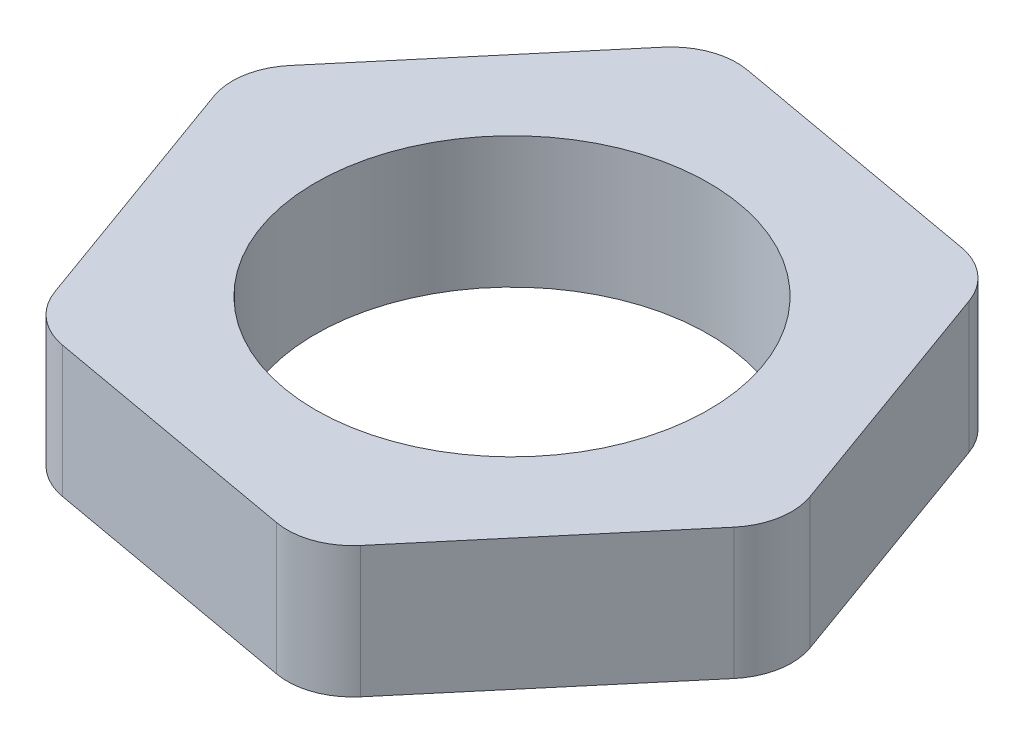
ISO-10303-21;
HEADER;
FILE_DESCRIPTION(('STEP AP214'),'2;1');
FILE_NAME('part.step','',(''),(''),'','','');
FILE_SCHEMA(('AUTOMOTIVE_DESIGN { 1 0 10303 214 1 1 1 1 }'));
ENDSEC;
DATA;
#1=APPLICATION_CONTEXT('core data for automotive mechanical design processes');
#2=APPLICATION_PROTOCOL_DEFINITION('international standard','automotive_design',2000,#1);
#3=PRODUCT_CONTEXT('',#1,'mechanical');
#4=PRODUCT('Part','Part','',(#3));
#5=PRODUCT_RELATED_PRODUCT_CATEGORY('part','',(#4));
#6=PRODUCT_DEFINITION_FORMATION('','',#4);
#7=PRODUCT_DEFINITION_CONTEXT('part definition',#1,'design');
#8=PRODUCT_DEFINITION('design','',#6,#7);
#9=PRODUCT_DEFINITION_SHAPE('','',#8);
#10=(LENGTH_UNIT() NAMED_UNIT(*) SI_UNIT(.MILLI.,.METRE.));
#11=(NAMED_UNIT(*) PLANE_ANGLE_UNIT() SI_UNIT($,.RADIAN.));
#12=(NAMED_UNIT(*) SI_UNIT($,.STERADIAN.) SOLID_ANGLE_UNIT());
#13=UNCERTAINTY_MEASURE_WITH_UNIT(LENGTH_MEASURE(1.E-05),#10,'distance_accuracy_value','');
#14=(GEOMETRIC_REPRESENTATION_CONTEXT(3) GLOBAL_UNCERTAINTY_ASSIGNED_CONTEXT((#13)) GLOBAL_UNIT_ASSIGNED_CONTEXT((#10,
#11,#12)) REPRESENTATION_CONTEXT('',''));
#15=CARTESIAN_POINT('',(0.,0.,0.));
#16=DIRECTION('',(0.,0.,1.));
#17=DIRECTION('',(1.,0.,0.));
#18=AXIS2_PLACEMENT_3D('',#15,#16,#17);
#19=CARTESIAN_POINT('',(0.,1.,0.));
#20=DIRECTION('',(0.,1.,0.));
#21=DIRECTION('',(0.,0.,1.));
#22=AXIS2_PLACEMENT_3D('',#19,#20,#21);
#23=PLANE('',#22);
#24=DIRECTION('',(-0.984368921946513,0.,-0.176118782376724));
#25=VECTOR('',#24,1.);
#26=CARTESIAN_POINT('',(1.675,1.,-1.98604506494691));
#27=LINE('',#26,#25);
#28=CARTESIAN_POINT('',(1.39083716896614,1.,-2.03688617815419));
#29=VERTEX_POINT('',#28);
#30=CARTESIAN_POINT('',(-0.598302648270884,1.,-2.39277397060512));
#31=VERTEX_POINT('',#30);
#32=EDGE_CURVE('E169',#29,#31,#27,.T.);
#33=ORIENTED_EDGE('',*,*,#32,.T.);
#34=CARTESIAN_POINT('',(-0.686362039459246,1.,-1.90058950963186));
#35=DIRECTION('',(0.,1.,0.));
#36=DIRECTION('',(0.,0.,1.));
#37=AXIS2_PLACEMENT_3D('',#34,#35,#36);
#38=CIRCLE('',#37,0.5);
#39=CARTESIAN_POINT('',(-1.06857659041586,1.,-2.2229434099294));
#40=VERTEX_POINT('',#39);
#41=EDGE_CURVE('E192',#31,#40,#38,.T.);
#42=ORIENTED_EDGE('',*,*,#41,.T.);
#43=DIRECTION('',(-0.644707800595082,0.,0.76442910191322));
#44=VECTOR('',#43,1.);
#45=CARTESIAN_POINT('',(-0.882465479304744,1.,-2.44361508381239));
#46=LINE('',#45,#44);
#47=CARTESIAN_POINT('',(-2.37135436819363,1.,-0.678241692748468));
#48=VERTEX_POINT('',#47);
#49=EDGE_CURVE('E145',#40,#48,#46,.T.);
#50=ORIENTED_EDGE('',*,*,#49,.T.);
#51=CARTESIAN_POINT('',(-1.98913981723702,1.,-0.355887792450927));
#52=DIRECTION('',(0.,1.,0.));
#53=DIRECTION('',(0.,0.,1.));
#54=AXIS2_PLACEMENT_3D('',#51,#52,#53);
#55=CIRCLE('',#54,0.5);
#56=CARTESIAN_POINT('',(-2.45941375938199,1.,-0.186057231775211));
#57=VERTEX_POINT('',#56);
#58=EDGE_CURVE('E190',#48,#57,#55,.T.);
#59=ORIENTED_EDGE('',*,*,#58,.T.);
#60=DIRECTION('',(0.339661121351431,0.,0.940547884289943));
#61=VECTOR('',#60,1.);
#62=CARTESIAN_POINT('',(-2.55746547930474,1.,-0.457570018865477));
#63=LINE('',#62,#61);
#64=CARTESIAN_POINT('',(-1.77305171992275,1.,1.71453227785665));
#65=VERTEX_POINT('',#64);
#66=EDGE_CURVE('E229',#57,#65,#63,.T.);
#67=ORIENTED_EDGE('',*,*,#66,.T.);
#68=CARTESIAN_POINT('',(-1.30277777777778,1.,1.54470171718093));
#69=DIRECTION('',(0.,1.,0.));
#70=DIRECTION('',(0.,0.,1.));
#71=AXIS2_PLACEMENT_3D('',#68,#69,#70);
#72=CIRCLE('',#71,0.5);
#73=CARTESIAN_POINT('',(-1.39083716896614,1.,2.03688617815419));
#74=VERTEX_POINT('',#73);
#75=EDGE_CURVE('E188',#65,#74,#72,.T.);
#76=ORIENTED_EDGE('',*,*,#75,.T.);
#77=DIRECTION('',(0.984368921946513,0.,0.176118782376724));
#78=VECTOR('',#77,1.);
#79=CARTESIAN_POINT('',(-1.675,1.,1.98604506494692));
#80=LINE('',#79,#78);
#81=CARTESIAN_POINT('',(0.598302648270884,1.,2.39277397060512));
#82=VERTEX_POINT('',#81);
#83=EDGE_CURVE('E224',#74,#82,#80,.T.);
#84=ORIENTED_EDGE('',*,*,#83,.T.);
#85=CARTESIAN_POINT('',(0.686362039459246,1.,1.90058950963186));
#86=DIRECTION('',(0.,1.,0.));
#87=DIRECTION('',(0.,0.,1.));
#88=AXIS2_PLACEMENT_3D('',#85,#86,#87);
#89=CIRCLE('',#88,0.5);
#90=CARTESIAN_POINT('',(1.06857659041586,1.,2.2229434099294));
#91=VERTEX_POINT('',#90);
#92=EDGE_CURVE('E186',#82,#91,#89,.T.);
#93=ORIENTED_EDGE('',*,*,#92,.T.);
#94=DIRECTION('',(0.644707800595082,0.,-0.76442910191322));
#95=VECTOR('',#94,1.);
#96=CARTESIAN_POINT('',(0.882465479304744,1.,2.44361508381239));
#97=LINE('',#96,#95);
#98=CARTESIAN_POINT('',(2.37135436819363,1.,0.678241692748468));
#99=VERTEX_POINT('',#98);
#100=EDGE_CURVE('E214',#91,#99,#97,.T.);
#101=ORIENTED_EDGE('',*,*,#100,.T.);
#102=CARTESIAN_POINT('',(1.98913981723702,1.,0.355887792450927));
#103=DIRECTION('',(0.,1.,0.));
#104=DIRECTION('',(0.,0.,1.));
#105=AXIS2_PLACEMENT_3D('',#102,#103,#104);
#106=CIRCLE('',#105,0.5);
#107=CARTESIAN_POINT('',(2.459413759382,1.,0.186057231775212));
#108=VERTEX_POINT('',#107);
#109=EDGE_CURVE('E56',#99,#108,#106,.T.);
#110=ORIENTED_EDGE('',*,*,#109,.T.);
#111=DIRECTION('',(-0.339661121351431,0.,-0.940547884289943));
#112=VECTOR('',#111,1.);
#113=CARTESIAN_POINT('',(2.55746547930474,1.,0.457570018865477));
#114=LINE('',#113,#112);
#115=CARTESIAN_POINT('',(1.77305171992275,1.,-1.71453227785665));
#116=VERTEX_POINT('',#115);
#117=EDGE_CURVE('E170',#108,#116,#114,.T.);
#118=ORIENTED_EDGE('',*,*,#117,.T.);
#119=CARTESIAN_POINT('',(1.30277777777778,1.,-1.54470171718093));
#120=DIRECTION('',(0.,1.,0.));
#121=DIRECTION('',(0.,0.,1.));
#122=AXIS2_PLACEMENT_3D('',#119,#120,#121);
#123=CIRCLE('',#122,0.5);
#124=EDGE_CURVE('E183',#116,#29,#123,.T.);
#125=ORIENTED_EDGE('',*,*,#124,.T.);
#126=EDGE_LOOP('',(#33,#42,#50,#59,#67,#76,#84,#93,#101,#110,#118,#125));
#127=FACE_BOUND('',#126,.T.);
#128=CARTESIAN_POINT('',(0.,1.,0.));
#129=DIRECTION('',(0.,1.,0.));
#130=DIRECTION('',(0.,0.,1.));
#131=AXIS2_PLACEMENT_3D('',#128,#129,#130);
#132=CIRCLE('',#131,1.5);
#133=CARTESIAN_POINT('',(0.,1.,1.5));
#134=VERTEX_POINT('',#133);
#135=EDGE_CURVE('E158',#134,#134,#132,.T.);
#136=ORIENTED_EDGE('',*,*,#135,.F.);
#137=EDGE_LOOP('',(#136));
#138=FACE_BOUND('',#137,.T.);
#139=ADVANCED_FACE('F35',(#127,#138),#23,.T.);
#140=CARTESIAN_POINT('',(0.,0.,0.));
#141=DIRECTION('',(0.,1.,0.));
#142=DIRECTION('',(0.,0.,1.));
#143=AXIS2_PLACEMENT_3D('',#140,#141,#142);
#144=PLANE('',#143);
#145=DIRECTION('',(-0.644707800595082,0.,0.76442910191322));
#146=VECTOR('',#145,1.);
#147=CARTESIAN_POINT('',(-0.882465479304744,0.,-2.44361508381239));
#148=LINE('',#147,#146);
#149=CARTESIAN_POINT('',(-1.06857659041586,0.,-2.2229434099294));
#150=VERTEX_POINT('',#149);
#151=CARTESIAN_POINT('',(-2.37135436819363,0.,-0.678241692748468));
#152=VERTEX_POINT('',#151);
#153=EDGE_CURVE('E142',#150,#152,#148,.T.);
#154=ORIENTED_EDGE('',*,*,#153,.F.);
#155=CARTESIAN_POINT('',(-0.686362039459246,0.,-1.90058950963186));
#156=DIRECTION('',(0.,1.,0.));
#157=DIRECTION('',(0.,0.,1.));
#158=AXIS2_PLACEMENT_3D('',#155,#156,#157);
#159=CIRCLE('',#158,0.5);
#160=CARTESIAN_POINT('',(-0.598302648270884,0.,-2.39277397060512));
#161=VERTEX_POINT('',#160);
#162=EDGE_CURVE('E125',#150,#161,#159,.F.);
#163=ORIENTED_EDGE('',*,*,#162,.T.);
#164=DIRECTION('',(-0.984368921946513,0.,-0.176118782376724));
#165=VECTOR('',#164,1.);
#166=CARTESIAN_POINT('',(1.675,0.,-1.98604506494691));
#167=LINE('',#166,#165);
#168=CARTESIAN_POINT('',(1.39083716896614,0.,-2.03688617815419));
#169=VERTEX_POINT('',#168);
#170=EDGE_CURVE('E153',#169,#161,#167,.T.);
#171=ORIENTED_EDGE('',*,*,#170,.F.);
#172=CARTESIAN_POINT('',(1.30277777777778,0.,-1.54470171718093));
#173=DIRECTION('',(0.,1.,0.));
#174=DIRECTION('',(0.,0.,1.));
#175=AXIS2_PLACEMENT_3D('',#172,#173,#174);
#176=CIRCLE('',#175,0.5);
#177=CARTESIAN_POINT('',(1.77305171992275,0.,-1.71453227785665));
#178=VERTEX_POINT('',#177);
#179=EDGE_CURVE('E146',#169,#178,#176,.F.);
#180=ORIENTED_EDGE('',*,*,#179,.T.);
#181=DIRECTION('',(-0.339661121351431,0.,-0.940547884289943));
#182=VECTOR('',#181,1.);
#183=CARTESIAN_POINT('',(2.55746547930474,0.,0.457570018865477));
#184=LINE('',#183,#182);
#185=CARTESIAN_POINT('',(2.459413759382,0.,0.186057231775212));
#186=VERTEX_POINT('',#185);
#187=EDGE_CURVE('E167',#186,#178,#184,.T.);
#188=ORIENTED_EDGE('',*,*,#187,.F.);
#189=CARTESIAN_POINT('',(1.98913981723702,0.,0.355887792450927));
#190=DIRECTION('',(0.,1.,0.));
#191=DIRECTION('',(0.,0.,1.));
#192=AXIS2_PLACEMENT_3D('',#189,#190,#191);
#193=CIRCLE('',#192,0.5);
#194=CARTESIAN_POINT('',(2.37135436819363,0.,0.678241692748468));
#195=VERTEX_POINT('',#194);
#196=EDGE_CURVE('E173',#186,#195,#193,.F.);
#197=ORIENTED_EDGE('',*,*,#196,.T.);
#198=DIRECTION('',(0.644707800595082,0.,-0.76442910191322));
#199=VECTOR('',#198,1.);
#200=CARTESIAN_POINT('',(0.882465479304744,0.,2.44361508381239));
#201=LINE('',#200,#199);
#202=CARTESIAN_POINT('',(1.06857659041586,0.,2.2229434099294));
#203=VERTEX_POINT('',#202);
#204=EDGE_CURVE('E164',#203,#195,#201,.T.);
#205=ORIENTED_EDGE('',*,*,#204,.F.);
#206=CARTESIAN_POINT('',(0.686362039459246,0.,1.90058950963186));
#207=DIRECTION('',(0.,1.,0.));
#208=DIRECTION('',(0.,0.,1.));
#209=AXIS2_PLACEMENT_3D('',#206,#207,#208);
#210=CIRCLE('',#209,0.5);
#211=CARTESIAN_POINT('',(0.598302648270884,0.,2.39277397060512));
#212=VERTEX_POINT('',#211);
#213=EDGE_CURVE('E175',#203,#212,#210,.F.);
#214=ORIENTED_EDGE('',*,*,#213,.T.);
#215=DIRECTION('',(0.984368921946513,0.,0.176118782376724));
#216=VECTOR('',#215,1.);
#217=CARTESIAN_POINT('',(-1.675,0.,1.98604506494692));
#218=LINE('',#217,#216);
#219=CARTESIAN_POINT('',(-1.39083716896614,0.,2.03688617815419));
#220=VERTEX_POINT('',#219);
#221=EDGE_CURVE('E156',#220,#212,#218,.T.);
#222=ORIENTED_EDGE('',*,*,#221,.F.);
#223=CARTESIAN_POINT('',(-1.30277777777778,0.,1.54470171718093));
#224=DIRECTION('',(0.,1.,0.));
#225=DIRECTION('',(0.,0.,1.));
#226=AXIS2_PLACEMENT_3D('',#223,#224,#225);
#227=CIRCLE('',#226,0.5);
#228=CARTESIAN_POINT('',(-1.77305171992275,0.,1.71453227785665));
#229=VERTEX_POINT('',#228);
#230=EDGE_CURVE('E177',#220,#229,#227,.F.);
#231=ORIENTED_EDGE('',*,*,#230,.T.);
#232=DIRECTION('',(0.339661121351431,0.,0.940547884289943));
#233=VECTOR('',#232,1.);
#234=CARTESIAN_POINT('',(-2.55746547930474,0.,-0.457570018865477));
#235=LINE('',#234,#233);
#236=CARTESIAN_POINT('',(-2.45941375938199,0.,-0.186057231775211));
#237=VERTEX_POINT('',#236);
#238=EDGE_CURVE('E152',#237,#229,#235,.T.);
#239=ORIENTED_EDGE('',*,*,#238,.F.);
#240=CARTESIAN_POINT('',(-1.98913981723702,0.,-0.355887792450927));
#241=DIRECTION('',(0.,1.,0.));
#242=DIRECTION('',(0.,0.,1.));
#243=AXIS2_PLACEMENT_3D('',#240,#241,#242);
#244=CIRCLE('',#243,0.5);
#245=EDGE_CURVE('E136',#237,#152,#244,.F.);
#246=ORIENTED_EDGE('',*,*,#245,.T.);
#247=EDGE_LOOP('',(#154,#163,#171,#180,#188,#197,#205,#214,#222,#231,#239,#246));
#248=FACE_BOUND('',#247,.T.);
#249=CARTESIAN_POINT('',(0.,0.,0.));
#250=DIRECTION('',(0.,1.,0.));
#251=DIRECTION('',(0.,0.,1.));
#252=AXIS2_PLACEMENT_3D('',#249,#250,#251);
#253=CIRCLE('',#252,1.5);
#254=CARTESIAN_POINT('',(0.,0.,1.5));
#255=VERTEX_POINT('',#254);
#256=EDGE_CURVE('E235',#255,#255,#253,.T.);
#257=ORIENTED_EDGE('',*,*,#256,.T.);
#258=EDGE_LOOP('',(#257));
#259=FACE_BOUND('',#258,.T.);
#260=ADVANCED_FACE('F149',(#248,#259),#144,.F.);
#261=CARTESIAN_POINT('',(1.675,1.,-1.98604506494691));
#262=DIRECTION('',(-0.176118782376724,0.,0.984368921946513));
#263=DIRECTION('',(0.984368921946513,0.,0.176118782376724));
#264=AXIS2_PLACEMENT_3D('',#261,#262,#263);
#265=PLANE('',#264);
#266=ORIENTED_EDGE('',*,*,#170,.T.);
#267=DIRECTION('',(0.,-1.,0.));
#268=VECTOR('',#267,1.);
#269=CARTESIAN_POINT('',(-0.598302648270884,1.,-2.39277397060512));
#270=LINE('',#269,#268);
#271=EDGE_CURVE('E130',#161,#31,#270,.F.);
#272=ORIENTED_EDGE('',*,*,#271,.T.);
#273=ORIENTED_EDGE('',*,*,#32,.F.);
#274=DIRECTION('',(0.,-1.,0.));
#275=VECTOR('',#274,1.);
#276=CARTESIAN_POINT('',(1.39083716896614,1.,-2.03688617815419));
#277=LINE('',#276,#275);
#278=EDGE_CURVE('E135',#29,#169,#277,.T.);
#279=ORIENTED_EDGE('',*,*,#278,.T.);
#280=EDGE_LOOP('',(#266,#272,#273,#279));
#281=FACE_BOUND('',#280,.T.);
#282=ADVANCED_FACE('F249',(#281),#265,.F.);
#283=CARTESIAN_POINT('',(-0.882465479304744,1.,-2.44361508381239));
#284=DIRECTION('',(0.76442910191322,0.,0.644707800595082));
#285=DIRECTION('',(0.644707800595082,0.,-0.76442910191322));
#286=AXIS2_PLACEMENT_3D('',#283,#284,#285);
#287=PLANE('',#286);
#288=ORIENTED_EDGE('',*,*,#49,.F.);
#289=DIRECTION('',(0.,-1.,0.));
#290=VECTOR('',#289,1.);
#291=CARTESIAN_POINT('',(-1.06857659041586,1.,-2.2229434099294));
#292=LINE('',#291,#290);
#293=EDGE_CURVE('E129',#40,#150,#292,.T.);
#294=ORIENTED_EDGE('',*,*,#293,.T.);
#295=ORIENTED_EDGE('',*,*,#153,.T.);
#296=DIRECTION('',(0.,-1.,0.));
#297=VECTOR('',#296,1.);
#298=CARTESIAN_POINT('',(-2.37135436819363,1.,-0.678241692748468));
#299=LINE('',#298,#297);
#300=EDGE_CURVE('E147',#152,#48,#299,.F.);
#301=ORIENTED_EDGE('',*,*,#300,.T.);
#302=EDGE_LOOP('',(#288,#294,#295,#301));
#303=FACE_BOUND('',#302,.T.);
#304=ADVANCED_FACE('F141',(#303),#287,.F.);
#305=CARTESIAN_POINT('',(-2.55746547930474,1.,-0.457570018865477));
#306=DIRECTION('',(0.940547884289944,0.,-0.339661121351431));
#307=DIRECTION('',(-0.339661121351431,0.,-0.940547884289943));
#308=AXIS2_PLACEMENT_3D('',#305,#306,#307);
#309=PLANE('',#308);
#310=ORIENTED_EDGE('',*,*,#66,.F.);
#311=DIRECTION('',(0.,-1.,0.));
#312=VECTOR('',#311,1.);
#313=CARTESIAN_POINT('',(-2.45941375938199,1.,-0.186057231775211));
#314=LINE('',#313,#312);
#315=EDGE_CURVE('E196',#57,#237,#314,.T.);
#316=ORIENTED_EDGE('',*,*,#315,.T.);
#317=ORIENTED_EDGE('',*,*,#238,.T.);
#318=DIRECTION('',(0.,-1.,0.));
#319=VECTOR('',#318,1.);
#320=CARTESIAN_POINT('',(-1.77305171992275,1.,1.71453227785665));
#321=LINE('',#320,#319);
#322=EDGE_CURVE('E194',#229,#65,#321,.F.);
#323=ORIENTED_EDGE('',*,*,#322,.T.);
#324=EDGE_LOOP('',(#310,#316,#317,#323));
#325=FACE_BOUND('',#324,.T.);
#326=ADVANCED_FACE('F260',(#325),#309,.F.);
#327=CARTESIAN_POINT('',(-1.675,1.,1.98604506494692));
#328=DIRECTION('',(0.176118782376724,0.,-0.984368921946513));
#329=DIRECTION('',(-0.984368921946513,0.,-0.176118782376724));
#330=AXIS2_PLACEMENT_3D('',#327,#328,#329);
#331=PLANE('',#330);
#332=ORIENTED_EDGE('',*,*,#83,.F.);
#333=DIRECTION('',(0.,-1.,0.));
#334=VECTOR('',#333,1.);
#335=CARTESIAN_POINT('',(-1.39083716896614,1.,2.03688617815419));
#336=LINE('',#335,#334);
#337=EDGE_CURVE('E201',#74,#220,#336,.T.);
#338=ORIENTED_EDGE('',*,*,#337,.T.);
#339=ORIENTED_EDGE('',*,*,#221,.T.);
#340=DIRECTION('',(0.,-1.,0.));
#341=VECTOR('',#340,1.);
#342=CARTESIAN_POINT('',(0.598302648270884,1.,2.39277397060512));
#343=LINE('',#342,#341);
#344=EDGE_CURVE('E199',#212,#82,#343,.F.);
#345=ORIENTED_EDGE('',*,*,#344,.T.);
#346=EDGE_LOOP('',(#332,#338,#339,#345));
#347=FACE_BOUND('',#346,.T.);
#348=ADVANCED_FACE('F257',(#347),#331,.F.);
#349=CARTESIAN_POINT('',(0.882465479304744,1.,2.44361508381239));
#350=DIRECTION('',(-0.76442910191322,0.,-0.644707800595082));
#351=DIRECTION('',(-0.644707800595082,0.,0.76442910191322));
#352=AXIS2_PLACEMENT_3D('',#349,#350,#351);
#353=PLANE('',#352);
#354=ORIENTED_EDGE('',*,*,#100,.F.);
#355=DIRECTION('',(0.,-1.,0.));
#356=VECTOR('',#355,1.);
#357=CARTESIAN_POINT('',(1.06857659041586,1.,2.2229434099294));
#358=LINE('',#357,#356);
#359=EDGE_CURVE('E206',#91,#203,#358,.T.);
#360=ORIENTED_EDGE('',*,*,#359,.T.);
#361=ORIENTED_EDGE('',*,*,#204,.T.);
#362=DIRECTION('',(0.,-1.,0.));
#363=VECTOR('',#362,1.);
#364=CARTESIAN_POINT('',(2.37135436819363,1.,0.678241692748468));
#365=LINE('',#364,#363);
#366=EDGE_CURVE('E204',#195,#99,#365,.F.);
#367=ORIENTED_EDGE('',*,*,#366,.T.);
#368=EDGE_LOOP('',(#354,#360,#361,#367));
#369=FACE_BOUND('',#368,.T.);
#370=ADVANCED_FACE('F212',(#369),#353,.F.);
#371=CARTESIAN_POINT('',(2.55746547930474,1.,0.457570018865477));
#372=DIRECTION('',(-0.940547884289944,0.,0.339661121351431));
#373=DIRECTION('',(0.339661121351431,0.,0.940547884289943));
#374=AXIS2_PLACEMENT_3D('',#371,#372,#373);
#375=PLANE('',#374);
#376=ORIENTED_EDGE('',*,*,#117,.F.);
#377=DIRECTION('',(0.,-1.,0.));
#378=VECTOR('',#377,1.);
#379=CARTESIAN_POINT('',(2.459413759382,1.,0.186057231775212));
#380=LINE('',#379,#378);
#381=EDGE_CURVE('E11',#108,#186,#380,.T.);
#382=ORIENTED_EDGE('',*,*,#381,.T.);
#383=ORIENTED_EDGE('',*,*,#187,.T.);
#384=DIRECTION('',(0.,-1.,0.));
#385=VECTOR('',#384,1.);
#386=CARTESIAN_POINT('',(1.77305171992275,1.,-1.71453227785665));
#387=LINE('',#386,#385);
#388=EDGE_CURVE('E43',#178,#116,#387,.F.);
#389=ORIENTED_EDGE('',*,*,#388,.T.);
#390=EDGE_LOOP('',(#376,#382,#383,#389));
#391=FACE_BOUND('',#390,.T.);
#392=ADVANCED_FACE('F222',(#391),#375,.F.);
#393=CARTESIAN_POINT('',(0.,1.,0.));
#394=DIRECTION('',(0.,-1.,0.));
#395=DIRECTION('',(0.,0.,-1.));
#396=AXIS2_PLACEMENT_3D('',#393,#394,#395);
#397=CYLINDRICAL_SURFACE('',#396,1.5);
#398=ORIENTED_EDGE('',*,*,#135,.T.);
#399=EDGE_LOOP('',(#398));
#400=FACE_BOUND('',#399,.T.);
#401=ORIENTED_EDGE('',*,*,#256,.F.);
#402=EDGE_LOOP('',(#401));
#403=FACE_BOUND('',#402,.T.);
#404=ADVANCED_FACE('F241',(#400,#403),#397,.F.);
#405=CARTESIAN_POINT('',(-0.686362039459246,1.,-1.90058950963186));
#406=DIRECTION('',(0.,-1.,0.));
#407=DIRECTION('',(0.,0.,-1.));
#408=AXIS2_PLACEMENT_3D('',#405,#406,#407);
#409=CYLINDRICAL_SURFACE('',#408,0.5);
#410=ORIENTED_EDGE('',*,*,#41,.F.);
#411=ORIENTED_EDGE('',*,*,#271,.F.);
#412=ORIENTED_EDGE('',*,*,#162,.F.);
#413=ORIENTED_EDGE('',*,*,#293,.F.);
#414=EDGE_LOOP('',(#410,#411,#412,#413));
#415=FACE_BOUND('',#414,.T.);
#416=ADVANCED_FACE('F128',(#415),#409,.T.);
#417=CARTESIAN_POINT('',(-1.98913981723702,1.,-0.355887792450927));
#418=DIRECTION('',(0.,-1.,0.));
#419=DIRECTION('',(0.,0.,-1.));
#420=AXIS2_PLACEMENT_3D('',#417,#418,#419);
#421=CYLINDRICAL_SURFACE('',#420,0.5);
#422=ORIENTED_EDGE('',*,*,#58,.F.);
#423=ORIENTED_EDGE('',*,*,#300,.F.);
#424=ORIENTED_EDGE('',*,*,#245,.F.);
#425=ORIENTED_EDGE('',*,*,#315,.F.);
#426=EDGE_LOOP('',(#422,#423,#424,#425));
#427=FACE_BOUND('',#426,.T.);
#428=ADVANCED_FACE('F272',(#427),#421,.T.);
#429=CARTESIAN_POINT('',(-1.30277777777778,1.,1.54470171718093));
#430=DIRECTION('',(0.,-1.,0.));
#431=DIRECTION('',(0.,0.,-1.));
#432=AXIS2_PLACEMENT_3D('',#429,#430,#431);
#433=CYLINDRICAL_SURFACE('',#432,0.5);
#434=ORIENTED_EDGE('',*,*,#75,.F.);
#435=ORIENTED_EDGE('',*,*,#322,.F.);
#436=ORIENTED_EDGE('',*,*,#230,.F.);
#437=ORIENTED_EDGE('',*,*,#337,.F.);
#438=EDGE_LOOP('',(#434,#435,#436,#437));
#439=FACE_BOUND('',#438,.T.);
#440=ADVANCED_FACE('F275',(#439),#433,.T.);
#441=CARTESIAN_POINT('',(0.686362039459246,1.,1.90058950963186));
#442=DIRECTION('',(0.,-1.,0.));
#443=DIRECTION('',(0.,0.,-1.));
#444=AXIS2_PLACEMENT_3D('',#441,#442,#443);
#445=CYLINDRICAL_SURFACE('',#444,0.5);
#446=ORIENTED_EDGE('',*,*,#92,.F.);
#447=ORIENTED_EDGE('',*,*,#344,.F.);
#448=ORIENTED_EDGE('',*,*,#213,.F.);
#449=ORIENTED_EDGE('',*,*,#359,.F.);
#450=EDGE_LOOP('',(#446,#447,#448,#449));
#451=FACE_BOUND('',#450,.T.);
#452=ADVANCED_FACE('F279',(#451),#445,.T.);
#453=CARTESIAN_POINT('',(1.98913981723702,1.,0.355887792450927));
#454=DIRECTION('',(0.,-1.,0.));
#455=DIRECTION('',(0.,0.,-1.));
#456=AXIS2_PLACEMENT_3D('',#453,#454,#455);
#457=CYLINDRICAL_SURFACE('',#456,0.5);
#458=ORIENTED_EDGE('',*,*,#109,.F.);
#459=ORIENTED_EDGE('',*,*,#366,.F.);
#460=ORIENTED_EDGE('',*,*,#196,.F.);
#461=ORIENTED_EDGE('',*,*,#381,.F.);
#462=EDGE_LOOP('',(#458,#459,#460,#461));
#463=FACE_BOUND('',#462,.T.);
#464=ADVANCED_FACE('F221',(#463),#457,.T.);
#465=CARTESIAN_POINT('',(1.30277777777778,1.,-1.54470171718093));
#466=DIRECTION('',(0.,-1.,0.));
#467=DIRECTION('',(0.,0.,-1.));
#468=AXIS2_PLACEMENT_3D('',#465,#466,#467);
#469=CYLINDRICAL_SURFACE('',#468,0.5);
#470=ORIENTED_EDGE('',*,*,#124,.F.);
#471=ORIENTED_EDGE('',*,*,#388,.F.);
#472=ORIENTED_EDGE('',*,*,#179,.F.);
#473=ORIENTED_EDGE('',*,*,#278,.F.);
#474=EDGE_LOOP('',(#470,#471,#472,#473));
#475=FACE_BOUND('',#474,.T.);
#476=ADVANCED_FACE('F37',(#475),#469,.T.);
#477=CLOSED_SHELL('',(#139,#260,#282,#304,#326,#348,#370,#392,#404,#416,#428,#440,#452,#464,#476));
#478=MANIFOLD_SOLID_BREP('B2',#477);
#479=ADVANCED_BREP_SHAPE_REPRESENTATION('',(#18,#478),#14);
#480=SHAPE_DEFINITION_REPRESENTATION(#9,#479);
ENDSEC;
END-ISO-10303-21;
